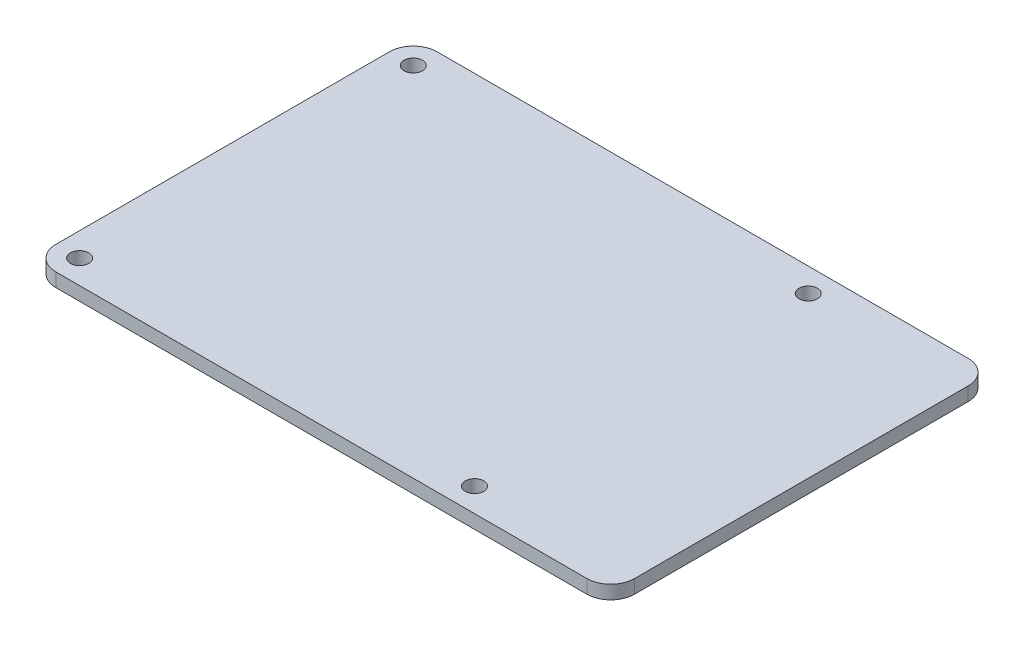
ISO-10303-21;
HEADER;
FILE_DESCRIPTION(('STEP AP214'),'2;1');
FILE_NAME('part.step','',(''),(''),'','','');
FILE_SCHEMA(('AUTOMOTIVE_DESIGN { 1 0 10303 214 1 1 1 1 }'));
ENDSEC;
DATA;
#1=APPLICATION_CONTEXT('core data for automotive mechanical design processes');
#2=APPLICATION_PROTOCOL_DEFINITION('international standard','automotive_design',2000,#1);
#3=PRODUCT_CONTEXT('',#1,'mechanical');
#4=PRODUCT('Part','Part','',(#3));
#5=PRODUCT_RELATED_PRODUCT_CATEGORY('part','',(#4));
#6=PRODUCT_DEFINITION_FORMATION('','',#4);
#7=PRODUCT_DEFINITION_CONTEXT('part definition',#1,'design');
#8=PRODUCT_DEFINITION('design','',#6,#7);
#9=PRODUCT_DEFINITION_SHAPE('','',#8);
#10=(LENGTH_UNIT() NAMED_UNIT(*) SI_UNIT(.MILLI.,.METRE.));
#11=(NAMED_UNIT(*) PLANE_ANGLE_UNIT() SI_UNIT($,.RADIAN.));
#12=(NAMED_UNIT(*) SI_UNIT($,.STERADIAN.) SOLID_ANGLE_UNIT());
#13=UNCERTAINTY_MEASURE_WITH_UNIT(LENGTH_MEASURE(1.E-05),#10,'distance_accuracy_value','');
#14=(GEOMETRIC_REPRESENTATION_CONTEXT(3) GLOBAL_UNCERTAINTY_ASSIGNED_CONTEXT((#13)) GLOBAL_UNIT_ASSIGNED_CONTEXT((#10,
#11,#12)) REPRESENTATION_CONTEXT('',''));
#15=CARTESIAN_POINT('',(0.,0.,0.));
#16=DIRECTION('',(0.,0.,1.));
#17=DIRECTION('',(1.,0.,0.));
#18=AXIS2_PLACEMENT_3D('',#15,#16,#17);
#19=CARTESIAN_POINT('',(42.5,2.,-28.));
#20=DIRECTION('',(-1.,0.,0.));
#21=DIRECTION('',(0.,0.,1.));
#22=AXIS2_PLACEMENT_3D('',#19,#20,#21);
#23=PLANE('',#22);
#24=DIRECTION('',(0.,0.,-1.));
#25=VECTOR('',#24,1.);
#26=CARTESIAN_POINT('',(42.5,0.,-28.));
#27=LINE('',#26,#25);
#28=CARTESIAN_POINT('',(42.5,0.,24.5));
#29=VERTEX_POINT('',#28);
#30=CARTESIAN_POINT('',(42.5,0.,-24.5));
#31=VERTEX_POINT('',#30);
#32=EDGE_CURVE('E132',#29,#31,#27,.T.);
#33=ORIENTED_EDGE('',*,*,#32,.T.);
#34=DIRECTION('',(0.,-1.,0.));
#35=VECTOR('',#34,1.);
#36=CARTESIAN_POINT('',(42.5,2.,-24.5));
#37=LINE('',#36,#35);
#38=CARTESIAN_POINT('',(42.5,2.,-24.5));
#39=VERTEX_POINT('',#38);
#40=EDGE_CURVE('E109',#31,#39,#37,.F.);
#41=ORIENTED_EDGE('',*,*,#40,.T.);
#42=DIRECTION('',(0.,0.,-1.));
#43=VECTOR('',#42,1.);
#44=CARTESIAN_POINT('',(42.5,2.,-28.));
#45=LINE('',#44,#43);
#46=CARTESIAN_POINT('',(42.5,2.,24.5));
#47=VERTEX_POINT('',#46);
#48=EDGE_CURVE('E142',#47,#39,#45,.T.);
#49=ORIENTED_EDGE('',*,*,#48,.F.);
#50=DIRECTION('',(0.,-1.,0.));
#51=VECTOR('',#50,1.);
#52=CARTESIAN_POINT('',(42.5,2.,24.5));
#53=LINE('',#52,#51);
#54=EDGE_CURVE('E114',#47,#29,#53,.T.);
#55=ORIENTED_EDGE('',*,*,#54,.T.);
#56=EDGE_LOOP('',(#33,#41,#49,#55));
#57=FACE_BOUND('',#56,.T.);
#58=ADVANCED_FACE('F37',(#57),#23,.F.);
#59=CARTESIAN_POINT('',(-42.5,2.,-28.));
#60=DIRECTION('',(0.,0.,1.));
#61=DIRECTION('',(1.,0.,0.));
#62=AXIS2_PLACEMENT_3D('',#59,#60,#61);
#63=PLANE('',#62);
#64=DIRECTION('',(-1.,0.,0.));
#65=VECTOR('',#64,1.);
#66=CARTESIAN_POINT('',(-42.5,2.,-28.));
#67=LINE('',#66,#65);
#68=CARTESIAN_POINT('',(39.,2.,-28.));
#69=VERTEX_POINT('',#68);
#70=CARTESIAN_POINT('',(-39.,2.,-28.));
#71=VERTEX_POINT('',#70);
#72=EDGE_CURVE('E124',#69,#71,#67,.T.);
#73=ORIENTED_EDGE('',*,*,#72,.F.);
#74=DIRECTION('',(0.,-1.,0.));
#75=VECTOR('',#74,1.);
#76=CARTESIAN_POINT('',(39.,2.,-28.));
#77=LINE('',#76,#75);
#78=CARTESIAN_POINT('',(39.,0.,-28.));
#79=VERTEX_POINT('',#78);
#80=EDGE_CURVE('E108',#69,#79,#77,.T.);
#81=ORIENTED_EDGE('',*,*,#80,.T.);
#82=DIRECTION('',(-1.,0.,0.));
#83=VECTOR('',#82,1.);
#84=CARTESIAN_POINT('',(-42.5,0.,-28.));
#85=LINE('',#84,#83);
#86=CARTESIAN_POINT('',(-39.,0.,-28.));
#87=VERTEX_POINT('',#86);
#88=EDGE_CURVE('E121',#79,#87,#85,.T.);
#89=ORIENTED_EDGE('',*,*,#88,.T.);
#90=DIRECTION('',(0.,-1.,0.));
#91=VECTOR('',#90,1.);
#92=CARTESIAN_POINT('',(-39.,2.,-28.));
#93=LINE('',#92,#91);
#94=EDGE_CURVE('E126',#87,#71,#93,.F.);
#95=ORIENTED_EDGE('',*,*,#94,.T.);
#96=EDGE_LOOP('',(#73,#81,#89,#95));
#97=FACE_BOUND('',#96,.T.);
#98=ADVANCED_FACE('F120',(#97),#63,.F.);
#99=CARTESIAN_POINT('',(-42.5,2.,-28.));
#100=DIRECTION('',(1.,0.,0.));
#101=DIRECTION('',(0.,0.,-1.));
#102=AXIS2_PLACEMENT_3D('',#99,#100,#101);
#103=PLANE('',#102);
#104=DIRECTION('',(0.,0.,1.));
#105=VECTOR('',#104,1.);
#106=CARTESIAN_POINT('',(-42.5,2.,-28.));
#107=LINE('',#106,#105);
#108=CARTESIAN_POINT('',(-42.5,2.,-24.5));
#109=VERTEX_POINT('',#108);
#110=CARTESIAN_POINT('',(-42.5,2.,24.5));
#111=VERTEX_POINT('',#110);
#112=EDGE_CURVE('E165',#109,#111,#107,.T.);
#113=ORIENTED_EDGE('',*,*,#112,.F.);
#114=DIRECTION('',(0.,-1.,0.));
#115=VECTOR('',#114,1.);
#116=CARTESIAN_POINT('',(-42.5,2.,-24.5));
#117=LINE('',#116,#115);
#118=CARTESIAN_POINT('',(-42.5,0.,-24.5));
#119=VERTEX_POINT('',#118);
#120=EDGE_CURVE('E11',#109,#119,#117,.T.);
#121=ORIENTED_EDGE('',*,*,#120,.T.);
#122=DIRECTION('',(0.,0.,1.));
#123=VECTOR('',#122,1.);
#124=CARTESIAN_POINT('',(-42.5,0.,-28.));
#125=LINE('',#124,#123);
#126=CARTESIAN_POINT('',(-42.5,0.,24.5));
#127=VERTEX_POINT('',#126);
#128=EDGE_CURVE('E131',#119,#127,#125,.T.);
#129=ORIENTED_EDGE('',*,*,#128,.T.);
#130=DIRECTION('',(0.,-1.,0.));
#131=VECTOR('',#130,1.);
#132=CARTESIAN_POINT('',(-42.5,2.,24.5));
#133=LINE('',#132,#131);
#134=EDGE_CURVE('E45',#127,#111,#133,.F.);
#135=ORIENTED_EDGE('',*,*,#134,.T.);
#136=EDGE_LOOP('',(#113,#121,#129,#135));
#137=FACE_BOUND('',#136,.T.);
#138=ADVANCED_FACE('F164',(#137),#103,.F.);
#139=CARTESIAN_POINT('',(-42.5,2.,28.));
#140=DIRECTION('',(0.,0.,-1.));
#141=DIRECTION('',(-1.,0.,0.));
#142=AXIS2_PLACEMENT_3D('',#139,#140,#141);
#143=PLANE('',#142);
#144=DIRECTION('',(1.,0.,0.));
#145=VECTOR('',#144,1.);
#146=CARTESIAN_POINT('',(-42.5,0.,28.));
#147=LINE('',#146,#145);
#148=CARTESIAN_POINT('',(-39.,0.,28.));
#149=VERTEX_POINT('',#148);
#150=CARTESIAN_POINT('',(39.,0.,28.));
#151=VERTEX_POINT('',#150);
#152=EDGE_CURVE('E135',#149,#151,#147,.T.);
#153=ORIENTED_EDGE('',*,*,#152,.T.);
#154=DIRECTION('',(0.,-1.,0.));
#155=VECTOR('',#154,1.);
#156=CARTESIAN_POINT('',(39.,2.,28.));
#157=LINE('',#156,#155);
#158=CARTESIAN_POINT('',(39.,2.,28.));
#159=VERTEX_POINT('',#158);
#160=EDGE_CURVE('E52',#151,#159,#157,.F.);
#161=ORIENTED_EDGE('',*,*,#160,.T.);
#162=DIRECTION('',(1.,0.,0.));
#163=VECTOR('',#162,1.);
#164=CARTESIAN_POINT('',(-42.5,2.,28.));
#165=LINE('',#164,#163);
#166=CARTESIAN_POINT('',(-39.,2.,28.));
#167=VERTEX_POINT('',#166);
#168=EDGE_CURVE('E143',#167,#159,#165,.T.);
#169=ORIENTED_EDGE('',*,*,#168,.F.);
#170=DIRECTION('',(0.,-1.,0.));
#171=VECTOR('',#170,1.);
#172=CARTESIAN_POINT('',(-39.,2.,28.));
#173=LINE('',#172,#171);
#174=EDGE_CURVE('E158',#167,#149,#173,.T.);
#175=ORIENTED_EDGE('',*,*,#174,.T.);
#176=EDGE_LOOP('',(#153,#161,#169,#175));
#177=FACE_BOUND('',#176,.T.);
#178=ADVANCED_FACE('F174',(#177),#143,.F.);
#179=CARTESIAN_POINT('',(0.,2.,0.));
#180=DIRECTION('',(0.,1.,0.));
#181=DIRECTION('',(0.,0.,1.));
#182=AXIS2_PLACEMENT_3D('',#179,#180,#181);
#183=PLANE('',#182);
#184=CARTESIAN_POINT('',(19.,2.,-24.5));
#185=DIRECTION('',(0.,1.,0.));
#186=DIRECTION('',(0.,0.,1.));
#187=AXIS2_PLACEMENT_3D('',#184,#185,#186);
#188=CIRCLE('',#187,1.35);
#189=CARTESIAN_POINT('',(19.,2.,-23.15));
#190=VERTEX_POINT('',#189);
#191=EDGE_CURVE('E187',#190,#190,#188,.T.);
#192=ORIENTED_EDGE('',*,*,#191,.F.);
#193=EDGE_LOOP('',(#192));
#194=FACE_BOUND('',#193,.T.);
#195=CARTESIAN_POINT('',(-39.,2.,24.5));
#196=DIRECTION('',(0.,1.,0.));
#197=DIRECTION('',(0.,0.,1.));
#198=AXIS2_PLACEMENT_3D('',#195,#196,#197);
#199=CIRCLE('',#198,1.35);
#200=CARTESIAN_POINT('',(-39.,2.,25.85));
#201=VERTEX_POINT('',#200);
#202=EDGE_CURVE('E193',#201,#201,#199,.T.);
#203=ORIENTED_EDGE('',*,*,#202,.F.);
#204=EDGE_LOOP('',(#203));
#205=FACE_BOUND('',#204,.T.);
#206=CARTESIAN_POINT('',(19.,2.,24.5));
#207=DIRECTION('',(0.,1.,0.));
#208=DIRECTION('',(0.,0.,1.));
#209=AXIS2_PLACEMENT_3D('',#206,#207,#208);
#210=CIRCLE('',#209,1.35);
#211=CARTESIAN_POINT('',(19.,2.,25.85));
#212=VERTEX_POINT('',#211);
#213=EDGE_CURVE('E194',#212,#212,#210,.T.);
#214=ORIENTED_EDGE('',*,*,#213,.F.);
#215=EDGE_LOOP('',(#214));
#216=FACE_BOUND('',#215,.T.);
#217=CARTESIAN_POINT('',(-39.,2.,-24.5));
#218=DIRECTION('',(0.,1.,0.));
#219=DIRECTION('',(0.,0.,1.));
#220=AXIS2_PLACEMENT_3D('',#217,#218,#219);
#221=CIRCLE('',#220,1.35);
#222=CARTESIAN_POINT('',(-39.,2.,-23.15));
#223=VERTEX_POINT('',#222);
#224=EDGE_CURVE('E184',#223,#223,#221,.T.);
#225=ORIENTED_EDGE('',*,*,#224,.F.);
#226=EDGE_LOOP('',(#225));
#227=FACE_BOUND('',#226,.T.);
#228=ORIENTED_EDGE('',*,*,#48,.T.);
#229=CARTESIAN_POINT('',(39.,2.,-24.5));
#230=DIRECTION('',(0.,1.,0.));
#231=DIRECTION('',(0.,0.,1.));
#232=AXIS2_PLACEMENT_3D('',#229,#230,#231);
#233=CIRCLE('',#232,3.5);
#234=EDGE_CURVE('E156',#39,#69,#233,.T.);
#235=ORIENTED_EDGE('',*,*,#234,.T.);
#236=ORIENTED_EDGE('',*,*,#72,.T.);
#237=CARTESIAN_POINT('',(-39.,2.,-24.5));
#238=DIRECTION('',(0.,1.,0.));
#239=DIRECTION('',(0.,0.,1.));
#240=AXIS2_PLACEMENT_3D('',#237,#238,#239);
#241=CIRCLE('',#240,3.5);
#242=EDGE_CURVE('E152',#71,#109,#241,.T.);
#243=ORIENTED_EDGE('',*,*,#242,.T.);
#244=ORIENTED_EDGE('',*,*,#112,.T.);
#245=CARTESIAN_POINT('',(-39.,2.,24.5));
#246=DIRECTION('',(0.,1.,0.));
#247=DIRECTION('',(0.,0.,1.));
#248=AXIS2_PLACEMENT_3D('',#245,#246,#247);
#249=CIRCLE('',#248,3.5);
#250=EDGE_CURVE('E59',#111,#167,#249,.T.);
#251=ORIENTED_EDGE('',*,*,#250,.T.);
#252=ORIENTED_EDGE('',*,*,#168,.T.);
#253=CARTESIAN_POINT('',(39.,2.,24.5));
#254=DIRECTION('',(0.,1.,0.));
#255=DIRECTION('',(0.,0.,1.));
#256=AXIS2_PLACEMENT_3D('',#253,#254,#255);
#257=CIRCLE('',#256,3.5);
#258=EDGE_CURVE('E154',#159,#47,#257,.T.);
#259=ORIENTED_EDGE('',*,*,#258,.T.);
#260=EDGE_LOOP('',(#228,#235,#236,#243,#244,#251,#252,#259));
#261=FACE_BOUND('',#260,.T.);
#262=ADVANCED_FACE('F169',(#194,#205,#216,#227,#261),#183,.T.);
#263=CARTESIAN_POINT('',(0.,0.,0.));
#264=DIRECTION('',(0.,1.,0.));
#265=DIRECTION('',(0.,0.,1.));
#266=AXIS2_PLACEMENT_3D('',#263,#264,#265);
#267=PLANE('',#266);
#268=CARTESIAN_POINT('',(19.,0.,-24.5));
#269=DIRECTION('',(0.,1.,0.));
#270=DIRECTION('',(0.,0.,1.));
#271=AXIS2_PLACEMENT_3D('',#268,#269,#270);
#272=CIRCLE('',#271,1.35);
#273=CARTESIAN_POINT('',(19.,0.,-23.15));
#274=VERTEX_POINT('',#273);
#275=EDGE_CURVE('E197',#274,#274,#272,.T.);
#276=ORIENTED_EDGE('',*,*,#275,.T.);
#277=EDGE_LOOP('',(#276));
#278=FACE_BOUND('',#277,.T.);
#279=CARTESIAN_POINT('',(-39.,0.,24.5));
#280=DIRECTION('',(0.,1.,0.));
#281=DIRECTION('',(0.,0.,1.));
#282=AXIS2_PLACEMENT_3D('',#279,#280,#281);
#283=CIRCLE('',#282,1.35);
#284=CARTESIAN_POINT('',(-39.,0.,25.85));
#285=VERTEX_POINT('',#284);
#286=EDGE_CURVE('E190',#285,#285,#283,.T.);
#287=ORIENTED_EDGE('',*,*,#286,.T.);
#288=EDGE_LOOP('',(#287));
#289=FACE_BOUND('',#288,.T.);
#290=CARTESIAN_POINT('',(19.,0.,24.5));
#291=DIRECTION('',(0.,1.,0.));
#292=DIRECTION('',(0.,0.,1.));
#293=AXIS2_PLACEMENT_3D('',#290,#291,#292);
#294=CIRCLE('',#293,1.35);
#295=CARTESIAN_POINT('',(19.,0.,25.85));
#296=VERTEX_POINT('',#295);
#297=EDGE_CURVE('E202',#296,#296,#294,.T.);
#298=ORIENTED_EDGE('',*,*,#297,.T.);
#299=EDGE_LOOP('',(#298));
#300=FACE_BOUND('',#299,.T.);
#301=CARTESIAN_POINT('',(-39.,0.,-24.5));
#302=DIRECTION('',(0.,1.,0.));
#303=DIRECTION('',(0.,0.,1.));
#304=AXIS2_PLACEMENT_3D('',#301,#302,#303);
#305=CIRCLE('',#304,1.35);
#306=CARTESIAN_POINT('',(-39.,0.,-23.15));
#307=VERTEX_POINT('',#306);
#308=EDGE_CURVE('E137',#307,#307,#305,.T.);
#309=ORIENTED_EDGE('',*,*,#308,.T.);
#310=EDGE_LOOP('',(#309));
#311=FACE_BOUND('',#310,.T.);
#312=ORIENTED_EDGE('',*,*,#88,.F.);
#313=CARTESIAN_POINT('',(39.,0.,-24.5));
#314=DIRECTION('',(0.,1.,0.));
#315=DIRECTION('',(0.,0.,1.));
#316=AXIS2_PLACEMENT_3D('',#313,#314,#315);
#317=CIRCLE('',#316,3.5);
#318=EDGE_CURVE('E104',#79,#31,#317,.F.);
#319=ORIENTED_EDGE('',*,*,#318,.T.);
#320=ORIENTED_EDGE('',*,*,#32,.F.);
#321=CARTESIAN_POINT('',(39.,0.,24.5));
#322=DIRECTION('',(0.,1.,0.));
#323=DIRECTION('',(0.,0.,1.));
#324=AXIS2_PLACEMENT_3D('',#321,#322,#323);
#325=CIRCLE('',#324,3.5);
#326=EDGE_CURVE('E115',#29,#151,#325,.F.);
#327=ORIENTED_EDGE('',*,*,#326,.T.);
#328=ORIENTED_EDGE('',*,*,#152,.F.);
#329=CARTESIAN_POINT('',(-39.,0.,24.5));
#330=DIRECTION('',(0.,1.,0.));
#331=DIRECTION('',(0.,0.,1.));
#332=AXIS2_PLACEMENT_3D('',#329,#330,#331);
#333=CIRCLE('',#332,3.5);
#334=EDGE_CURVE('E125',#149,#127,#333,.F.);
#335=ORIENTED_EDGE('',*,*,#334,.T.);
#336=ORIENTED_EDGE('',*,*,#128,.F.);
#337=CARTESIAN_POINT('',(-39.,0.,-24.5));
#338=DIRECTION('',(0.,1.,0.));
#339=DIRECTION('',(0.,0.,1.));
#340=AXIS2_PLACEMENT_3D('',#337,#338,#339);
#341=CIRCLE('',#340,3.5);
#342=EDGE_CURVE('E130',#119,#87,#341,.F.);
#343=ORIENTED_EDGE('',*,*,#342,.T.);
#344=EDGE_LOOP('',(#312,#319,#320,#327,#328,#335,#336,#343));
#345=FACE_BOUND('',#344,.T.);
#346=ADVANCED_FACE('F128',(#278,#289,#300,#311,#345),#267,.F.);
#347=CARTESIAN_POINT('',(-39.,0.,-24.5));
#348=DIRECTION('',(0.,1.,0.));
#349=DIRECTION('',(0.,0.,1.));
#350=AXIS2_PLACEMENT_3D('',#347,#348,#349);
#351=CYLINDRICAL_SURFACE('',#350,1.35);
#352=ORIENTED_EDGE('',*,*,#308,.F.);
#353=EDGE_LOOP('',(#352));
#354=FACE_BOUND('',#353,.T.);
#355=ORIENTED_EDGE('',*,*,#224,.T.);
#356=EDGE_LOOP('',(#355));
#357=FACE_BOUND('',#356,.T.);
#358=ADVANCED_FACE('F216',(#354,#357),#351,.F.);
#359=CARTESIAN_POINT('',(19.,0.,24.5));
#360=DIRECTION('',(0.,1.,0.));
#361=DIRECTION('',(0.,0.,1.));
#362=AXIS2_PLACEMENT_3D('',#359,#360,#361);
#363=CYLINDRICAL_SURFACE('',#362,1.35);
#364=ORIENTED_EDGE('',*,*,#297,.F.);
#365=EDGE_LOOP('',(#364));
#366=FACE_BOUND('',#365,.T.);
#367=ORIENTED_EDGE('',*,*,#213,.T.);
#368=EDGE_LOOP('',(#367));
#369=FACE_BOUND('',#368,.T.);
#370=ADVANCED_FACE('F208',(#366,#369),#363,.F.);
#371=CARTESIAN_POINT('',(-39.,0.,24.5));
#372=DIRECTION('',(0.,1.,0.));
#373=DIRECTION('',(0.,0.,1.));
#374=AXIS2_PLACEMENT_3D('',#371,#372,#373);
#375=CYLINDRICAL_SURFACE('',#374,1.35);
#376=ORIENTED_EDGE('',*,*,#286,.F.);
#377=EDGE_LOOP('',(#376));
#378=FACE_BOUND('',#377,.T.);
#379=ORIENTED_EDGE('',*,*,#202,.T.);
#380=EDGE_LOOP('',(#379));
#381=FACE_BOUND('',#380,.T.);
#382=ADVANCED_FACE('F224',(#378,#381),#375,.F.);
#383=CARTESIAN_POINT('',(19.,0.,-24.5));
#384=DIRECTION('',(0.,1.,0.));
#385=DIRECTION('',(0.,0.,1.));
#386=AXIS2_PLACEMENT_3D('',#383,#384,#385);
#387=CYLINDRICAL_SURFACE('',#386,1.35);
#388=ORIENTED_EDGE('',*,*,#275,.F.);
#389=EDGE_LOOP('',(#388));
#390=FACE_BOUND('',#389,.T.);
#391=ORIENTED_EDGE('',*,*,#191,.T.);
#392=EDGE_LOOP('',(#391));
#393=FACE_BOUND('',#392,.T.);
#394=ADVANCED_FACE('F241',(#390,#393),#387,.F.);
#395=CARTESIAN_POINT('',(39.,2.,-24.5));
#396=DIRECTION('',(0.,-1.,0.));
#397=DIRECTION('',(0.,0.,-1.));
#398=AXIS2_PLACEMENT_3D('',#395,#396,#397);
#399=CYLINDRICAL_SURFACE('',#398,3.5);
#400=ORIENTED_EDGE('',*,*,#234,.F.);
#401=ORIENTED_EDGE('',*,*,#40,.F.);
#402=ORIENTED_EDGE('',*,*,#318,.F.);
#403=ORIENTED_EDGE('',*,*,#80,.F.);
#404=EDGE_LOOP('',(#400,#401,#402,#403));
#405=FACE_BOUND('',#404,.T.);
#406=ADVANCED_FACE('F107',(#405),#399,.T.);
#407=CARTESIAN_POINT('',(39.,2.,24.5));
#408=DIRECTION('',(0.,-1.,0.));
#409=DIRECTION('',(0.,0.,-1.));
#410=AXIS2_PLACEMENT_3D('',#407,#408,#409);
#411=CYLINDRICAL_SURFACE('',#410,3.5);
#412=ORIENTED_EDGE('',*,*,#258,.F.);
#413=ORIENTED_EDGE('',*,*,#160,.F.);
#414=ORIENTED_EDGE('',*,*,#326,.F.);
#415=ORIENTED_EDGE('',*,*,#54,.F.);
#416=EDGE_LOOP('',(#412,#413,#414,#415));
#417=FACE_BOUND('',#416,.T.);
#418=ADVANCED_FACE('F178',(#417),#411,.T.);
#419=CARTESIAN_POINT('',(-39.,2.,-24.5));
#420=DIRECTION('',(0.,-1.,0.));
#421=DIRECTION('',(0.,0.,-1.));
#422=AXIS2_PLACEMENT_3D('',#419,#420,#421);
#423=CYLINDRICAL_SURFACE('',#422,3.5);
#424=ORIENTED_EDGE('',*,*,#242,.F.);
#425=ORIENTED_EDGE('',*,*,#94,.F.);
#426=ORIENTED_EDGE('',*,*,#342,.F.);
#427=ORIENTED_EDGE('',*,*,#120,.F.);
#428=EDGE_LOOP('',(#424,#425,#426,#427));
#429=FACE_BOUND('',#428,.T.);
#430=ADVANCED_FACE('F243',(#429),#423,.T.);
#431=CARTESIAN_POINT('',(-39.,2.,24.5));
#432=DIRECTION('',(0.,-1.,0.));
#433=DIRECTION('',(0.,0.,-1.));
#434=AXIS2_PLACEMENT_3D('',#431,#432,#433);
#435=CYLINDRICAL_SURFACE('',#434,3.5);
#436=ORIENTED_EDGE('',*,*,#250,.F.);
#437=ORIENTED_EDGE('',*,*,#134,.F.);
#438=ORIENTED_EDGE('',*,*,#334,.F.);
#439=ORIENTED_EDGE('',*,*,#174,.F.);
#440=EDGE_LOOP('',(#436,#437,#438,#439));
#441=FACE_BOUND('',#440,.T.);
#442=ADVANCED_FACE('F39',(#441),#435,.T.);
#443=CLOSED_SHELL('',(#58,#98,#138,#178,#262,#346,#358,#370,#382,#394,#406,#418,#430,#442));
#444=MANIFOLD_SOLID_BREP('B2',#443);
#445=ADVANCED_BREP_SHAPE_REPRESENTATION('',(#18,#444),#14);
#446=SHAPE_DEFINITION_REPRESENTATION(#9,#445);
ENDSEC;
END-ISO-10303-21;
